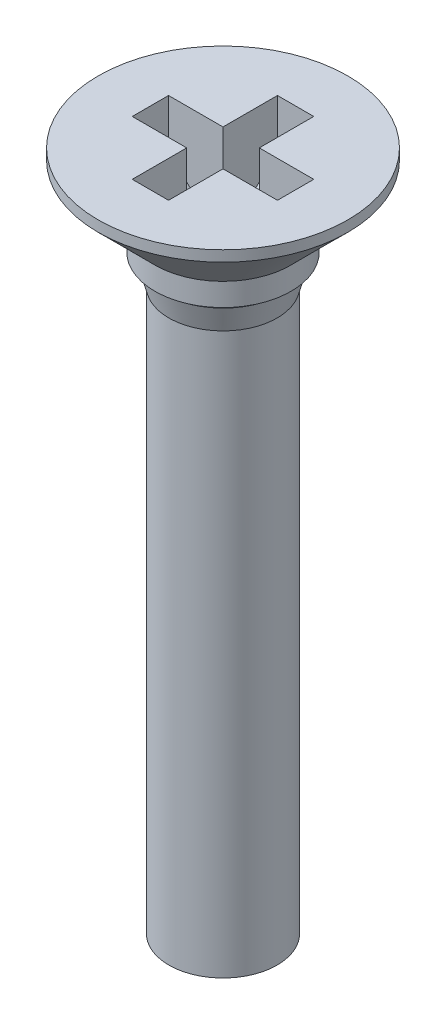
ISO-10303-21;
HEADER;
FILE_DESCRIPTION(('STEP AP214'),'2;1');
FILE_NAME('part.step','',(''),(''),'','','');
FILE_SCHEMA(('AUTOMOTIVE_DESIGN { 1 0 10303 214 1 1 1 1 }'));
ENDSEC;
DATA;
#1=APPLICATION_CONTEXT('core data for automotive mechanical design processes');
#2=APPLICATION_PROTOCOL_DEFINITION('international standard','automotive_design',2000,#1);
#3=PRODUCT_CONTEXT('',#1,'mechanical');
#4=PRODUCT('Part','Part','',(#3));
#5=PRODUCT_RELATED_PRODUCT_CATEGORY('part','',(#4));
#6=PRODUCT_DEFINITION_FORMATION('','',#4);
#7=PRODUCT_DEFINITION_CONTEXT('part definition',#1,'design');
#8=PRODUCT_DEFINITION('design','',#6,#7);
#9=PRODUCT_DEFINITION_SHAPE('','',#8);
#10=(LENGTH_UNIT() NAMED_UNIT(*) SI_UNIT(.MILLI.,.METRE.));
#11=(NAMED_UNIT(*) PLANE_ANGLE_UNIT() SI_UNIT($,.RADIAN.));
#12=(NAMED_UNIT(*) SI_UNIT($,.STERADIAN.) SOLID_ANGLE_UNIT());
#13=UNCERTAINTY_MEASURE_WITH_UNIT(LENGTH_MEASURE(1.E-05),#10,'distance_accuracy_value','');
#14=(GEOMETRIC_REPRESENTATION_CONTEXT(3) GLOBAL_UNCERTAINTY_ASSIGNED_CONTEXT((#13)) GLOBAL_UNIT_ASSIGNED_CONTEXT((#10,
#11,#12)) REPRESENTATION_CONTEXT('',''));
#15=CARTESIAN_POINT('',(0.,0.,0.));
#16=DIRECTION('',(0.,0.,1.));
#17=DIRECTION('',(1.,0.,0.));
#18=AXIS2_PLACEMENT_3D('',#15,#16,#17);
#19=CARTESIAN_POINT('',(0.,-2.65,-0.4));
#20=DIRECTION('',(0.,0.,-1.));
#21=DIRECTION('',(-1.,0.,0.));
#22=AXIS2_PLACEMENT_3D('',#19,#20,#21);
#23=PLANE('',#22);
#24=DIRECTION('',(0.,1.,0.));
#25=VECTOR('',#24,1.);
#26=CARTESIAN_POINT('',(0.4,-2.65,-0.4));
#27=LINE('',#26,#25);
#28=CARTESIAN_POINT('',(0.4,-2.1,-0.4));
#29=VERTEX_POINT('',#28);
#30=CARTESIAN_POINT('',(0.4,0.,-0.4));
#31=VERTEX_POINT('',#30);
#32=EDGE_CURVE('E208',#29,#31,#27,.T.);
#33=ORIENTED_EDGE('',*,*,#32,.F.);
#34=DIRECTION('',(1.,0.,0.));
#35=VECTOR('',#34,1.);
#36=CARTESIAN_POINT('',(-0.550000000000002,-2.1,-0.4));
#37=LINE('',#36,#35);
#38=CARTESIAN_POINT('',(0.550000000000002,-2.1,-0.4));
#39=VERTEX_POINT('',#38);
#40=EDGE_CURVE('E243',#29,#39,#37,.T.);
#41=ORIENTED_EDGE('',*,*,#40,.T.);
#42=DIRECTION('',(0.707106781186546,0.707106781186548,0.));
#43=VECTOR('',#42,1.);
#44=CARTESIAN_POINT('',(1.6,-1.05,-0.4));
#45=LINE('',#44,#43);
#46=CARTESIAN_POINT('',(1.6,-1.05,-0.4));
#47=VERTEX_POINT('',#46);
#48=EDGE_CURVE('E247',#39,#47,#45,.T.);
#49=ORIENTED_EDGE('',*,*,#48,.T.);
#50=DIRECTION('',(0.,1.,0.));
#51=VECTOR('',#50,1.);
#52=CARTESIAN_POINT('',(1.6,0.,-0.4));
#53=LINE('',#52,#51);
#54=CARTESIAN_POINT('',(1.6,0.,-0.4));
#55=VERTEX_POINT('',#54);
#56=EDGE_CURVE('E250',#47,#55,#53,.T.);
#57=ORIENTED_EDGE('',*,*,#56,.T.);
#58=DIRECTION('',(-1.,0.,0.));
#59=VECTOR('',#58,1.);
#60=CARTESIAN_POINT('',(1.6,0.,-0.4));
#61=LINE('',#60,#59);
#62=EDGE_CURVE('E254',#55,#31,#61,.T.);
#63=ORIENTED_EDGE('',*,*,#62,.T.);
#64=EDGE_LOOP('',(#33,#41,#49,#57,#63));
#65=FACE_BOUND('',#64,.T.);
#66=ADVANCED_FACE('F43',(#65),#23,.F.);
#67=CARTESIAN_POINT('',(0.,-2.65,0.4));
#68=DIRECTION('',(0.,0.,-1.));
#69=DIRECTION('',(-1.,0.,0.));
#70=AXIS2_PLACEMENT_3D('',#67,#68,#69);
#71=PLANE('',#70);
#72=DIRECTION('',(1.,0.,0.));
#73=VECTOR('',#72,1.);
#74=CARTESIAN_POINT('',(-0.550000000000002,-2.1,0.4));
#75=LINE('',#74,#73);
#76=CARTESIAN_POINT('',(0.4,-2.1,0.4));
#77=VERTEX_POINT('',#76);
#78=CARTESIAN_POINT('',(0.550000000000002,-2.1,0.4));
#79=VERTEX_POINT('',#78);
#80=EDGE_CURVE('E225',#77,#79,#75,.T.);
#81=ORIENTED_EDGE('',*,*,#80,.F.);
#82=DIRECTION('',(0.,1.,0.));
#83=VECTOR('',#82,1.);
#84=CARTESIAN_POINT('',(0.4,-2.65,0.4));
#85=LINE('',#84,#83);
#86=CARTESIAN_POINT('',(0.4,0.,0.4));
#87=VERTEX_POINT('',#86);
#88=EDGE_CURVE('E51',#77,#87,#85,.T.);
#89=ORIENTED_EDGE('',*,*,#88,.T.);
#90=DIRECTION('',(-1.,0.,0.));
#91=VECTOR('',#90,1.);
#92=CARTESIAN_POINT('',(1.6,0.,0.4));
#93=LINE('',#92,#91);
#94=CARTESIAN_POINT('',(1.6,0.,0.4));
#95=VERTEX_POINT('',#94);
#96=EDGE_CURVE('E234',#95,#87,#93,.T.);
#97=ORIENTED_EDGE('',*,*,#96,.F.);
#98=DIRECTION('',(0.,1.,0.));
#99=VECTOR('',#98,1.);
#100=CARTESIAN_POINT('',(1.6,0.,0.4));
#101=LINE('',#100,#99);
#102=CARTESIAN_POINT('',(1.6,-1.05,0.4));
#103=VERTEX_POINT('',#102);
#104=EDGE_CURVE('E231',#103,#95,#101,.T.);
#105=ORIENTED_EDGE('',*,*,#104,.F.);
#106=DIRECTION('',(0.707106781186546,0.707106781186548,0.));
#107=VECTOR('',#106,1.);
#108=CARTESIAN_POINT('',(1.6,-1.05,0.4));
#109=LINE('',#108,#107);
#110=EDGE_CURVE('E228',#79,#103,#109,.T.);
#111=ORIENTED_EDGE('',*,*,#110,.F.);
#112=EDGE_LOOP('',(#81,#89,#97,#105,#111));
#113=FACE_BOUND('',#112,.T.);
#114=ADVANCED_FACE('F297',(#113),#71,.T.);
#115=CARTESIAN_POINT('',(0.,0.,0.));
#116=DIRECTION('',(0.,-1.,0.));
#117=DIRECTION('',(1.,0.,0.));
#118=AXIS2_PLACEMENT_3D('',#115,#116,#117);
#119=PLANE('',#118);
#120=DIRECTION('',(1.,0.,0.));
#121=VECTOR('',#120,1.);
#122=CARTESIAN_POINT('',(-0.4,0.,1.6));
#123=LINE('',#122,#121);
#124=CARTESIAN_POINT('',(-0.4,0.,1.6));
#125=VERTEX_POINT('',#124);
#126=CARTESIAN_POINT('',(0.4,0.,1.6));
#127=VERTEX_POINT('',#126);
#128=EDGE_CURVE('E209',#125,#127,#123,.T.);
#129=ORIENTED_EDGE('',*,*,#128,.F.);
#130=DIRECTION('',(0.,0.,1.));
#131=VECTOR('',#130,1.);
#132=CARTESIAN_POINT('',(-0.4,0.,-1.6));
#133=LINE('',#132,#131);
#134=CARTESIAN_POINT('',(-0.4,0.,0.399999999999999));
#135=VERTEX_POINT('',#134);
#136=EDGE_CURVE('E202',#135,#125,#133,.T.);
#137=ORIENTED_EDGE('',*,*,#136,.F.);
#138=CARTESIAN_POINT('',(-1.6,0.,0.4));
#139=VERTEX_POINT('',#138);
#140=EDGE_CURVE('E233',#135,#139,#93,.T.);
#141=ORIENTED_EDGE('',*,*,#140,.T.);
#142=DIRECTION('',(0.,0.,1.));
#143=VECTOR('',#142,1.);
#144=CARTESIAN_POINT('',(-1.6,0.,-0.4));
#145=LINE('',#144,#143);
#146=CARTESIAN_POINT('',(-1.6,0.,-0.4));
#147=VERTEX_POINT('',#146);
#148=EDGE_CURVE('E264',#147,#139,#145,.T.);
#149=ORIENTED_EDGE('',*,*,#148,.F.);
#150=CARTESIAN_POINT('',(-0.4,0.,-0.4));
#151=VERTEX_POINT('',#150);
#152=EDGE_CURVE('E253',#151,#147,#61,.T.);
#153=ORIENTED_EDGE('',*,*,#152,.F.);
#154=CARTESIAN_POINT('',(-0.4,0.,-1.6));
#155=VERTEX_POINT('',#154);
#156=EDGE_CURVE('E203',#155,#151,#133,.T.);
#157=ORIENTED_EDGE('',*,*,#156,.F.);
#158=DIRECTION('',(1.,0.,0.));
#159=VECTOR('',#158,1.);
#160=CARTESIAN_POINT('',(-0.4,0.,-1.6));
#161=LINE('',#160,#159);
#162=CARTESIAN_POINT('',(0.4,0.,-1.6));
#163=VERTEX_POINT('',#162);
#164=EDGE_CURVE('E211',#155,#163,#161,.T.);
#165=ORIENTED_EDGE('',*,*,#164,.T.);
#166=DIRECTION('',(0.,0.,1.));
#167=VECTOR('',#166,1.);
#168=CARTESIAN_POINT('',(0.4,0.,-1.6));
#169=LINE('',#168,#167);
#170=EDGE_CURVE('E187',#163,#31,#169,.T.);
#171=ORIENTED_EDGE('',*,*,#170,.T.);
#172=ORIENTED_EDGE('',*,*,#62,.F.);
#173=DIRECTION('',(0.,0.,1.));
#174=VECTOR('',#173,1.);
#175=CARTESIAN_POINT('',(1.6,0.,-0.4));
#176=LINE('',#175,#174);
#177=EDGE_CURVE('E267',#55,#95,#176,.T.);
#178=ORIENTED_EDGE('',*,*,#177,.T.);
#179=ORIENTED_EDGE('',*,*,#96,.T.);
#180=EDGE_CURVE('E66',#87,#127,#169,.T.);
#181=ORIENTED_EDGE('',*,*,#180,.T.);
#182=EDGE_LOOP('',(#129,#137,#141,#149,#153,#157,#165,#171,#172,#178,#179,#181));
#183=FACE_BOUND('',#182,.T.);
#184=CARTESIAN_POINT('',(0.,0.,0.));
#185=DIRECTION('',(0.,1.,0.));
#186=DIRECTION('',(-1.,0.,0.));
#187=AXIS2_PLACEMENT_3D('',#184,#185,#186);
#188=CIRCLE('',#187,2.75);
#189=CARTESIAN_POINT('',(-2.75,0.,0.));
#190=VERTEX_POINT('',#189);
#191=EDGE_CURVE('E293',#190,#190,#188,.T.);
#192=ORIENTED_EDGE('',*,*,#191,.T.);
#193=EDGE_LOOP('',(#192));
#194=FACE_BOUND('',#193,.T.);
#195=ADVANCED_FACE('F45',(#183,#194),#119,.F.);
#196=CARTESIAN_POINT('',(0.,0.,0.));
#197=DIRECTION('',(0.,1.,0.));
#198=DIRECTION('',(-1.,0.,0.));
#199=AXIS2_PLACEMENT_3D('',#196,#197,#198);
#200=CYLINDRICAL_SURFACE('',#199,2.75);
#201=ORIENTED_EDGE('',*,*,#191,.F.);
#202=EDGE_LOOP('',(#201));
#203=FACE_BOUND('',#202,.T.);
#204=CARTESIAN_POINT('',(0.,-0.237500000000007,0.));
#205=DIRECTION('',(0.,1.,0.));
#206=DIRECTION('',(-1.,0.,0.));
#207=AXIS2_PLACEMENT_3D('',#204,#205,#206);
#208=CIRCLE('',#207,2.75);
#209=CARTESIAN_POINT('',(-2.75,-0.237500000000007,0.));
#210=VERTEX_POINT('',#209);
#211=EDGE_CURVE('E290',#210,#210,#208,.T.);
#212=ORIENTED_EDGE('',*,*,#211,.T.);
#213=EDGE_LOOP('',(#212));
#214=FACE_BOUND('',#213,.T.);
#215=ADVANCED_FACE('F402',(#203,#214),#200,.T.);
#216=CARTESIAN_POINT('',(0.,-1.4875,0.));
#217=DIRECTION('',(0.,1.,0.));
#218=DIRECTION('',(-1.,0.,0.));
#219=AXIS2_PLACEMENT_3D('',#216,#217,#218);
#220=CONICAL_SURFACE('',#219,1.5,0.78539816339745);
#221=ORIENTED_EDGE('',*,*,#211,.F.);
#222=EDGE_LOOP('',(#221));
#223=FACE_BOUND('',#222,.T.);
#224=CARTESIAN_POINT('',(0.,-1.4875,0.));
#225=DIRECTION('',(0.,1.,0.));
#226=DIRECTION('',(-1.,0.,0.));
#227=AXIS2_PLACEMENT_3D('',#224,#225,#226);
#228=CIRCLE('',#227,1.5);
#229=CARTESIAN_POINT('',(-1.5,-1.4875,0.));
#230=VERTEX_POINT('',#229);
#231=EDGE_CURVE('E287',#230,#230,#228,.T.);
#232=ORIENTED_EDGE('',*,*,#231,.T.);
#233=EDGE_LOOP('',(#232));
#234=FACE_BOUND('',#233,.T.);
#235=ADVANCED_FACE('F399',(#223,#234),#220,.T.);
#236=CARTESIAN_POINT('',(0.,0.,0.));
#237=DIRECTION('',(0.,1.,0.));
#238=DIRECTION('',(-1.,0.,0.));
#239=AXIS2_PLACEMENT_3D('',#236,#237,#238);
#240=CYLINDRICAL_SURFACE('',#239,1.5);
#241=ORIENTED_EDGE('',*,*,#231,.F.);
#242=EDGE_LOOP('',(#241));
#243=FACE_BOUND('',#242,.T.);
#244=CARTESIAN_POINT('',(0.,-1.9875,0.));
#245=DIRECTION('',(0.,1.,0.));
#246=DIRECTION('',(-1.,0.,0.));
#247=AXIS2_PLACEMENT_3D('',#244,#245,#246);
#248=CIRCLE('',#247,1.5);
#249=CARTESIAN_POINT('',(-1.5,-1.9875,0.));
#250=VERTEX_POINT('',#249);
#251=EDGE_CURVE('E284',#250,#250,#248,.T.);
#252=ORIENTED_EDGE('',*,*,#251,.T.);
#253=EDGE_LOOP('',(#252));
#254=FACE_BOUND('',#253,.T.);
#255=ADVANCED_FACE('F395',(#243,#254),#240,.T.);
#256=CARTESIAN_POINT('',(1.5,-1.9875,0.));
#257=DIRECTION('',(0.,1.,0.));
#258=DIRECTION('',(-1.,0.,0.));
#259=AXIS2_PLACEMENT_3D('',#256,#257,#258);
#260=PLANE('',#259);
#261=ORIENTED_EDGE('',*,*,#251,.F.);
#262=EDGE_LOOP('',(#261));
#263=FACE_BOUND('',#262,.T.);
#264=CARTESIAN_POINT('',(0.,-1.9875,0.));
#265=DIRECTION('',(0.,1.,0.));
#266=DIRECTION('',(-1.,0.,0.));
#267=AXIS2_PLACEMENT_3D('',#264,#265,#266);
#268=CIRCLE('',#267,1.3375);
#269=CARTESIAN_POINT('',(-1.3375,-1.9875,0.));
#270=VERTEX_POINT('',#269);
#271=EDGE_CURVE('E281',#270,#270,#268,.T.);
#272=ORIENTED_EDGE('',*,*,#271,.T.);
#273=EDGE_LOOP('',(#272));
#274=FACE_BOUND('',#273,.T.);
#275=ADVANCED_FACE('F391',(#263,#274),#260,.F.);
#276=CARTESIAN_POINT('',(0.,0.,0.));
#277=DIRECTION('',(0.,1.,0.));
#278=DIRECTION('',(-1.,0.,0.));
#279=AXIS2_PLACEMENT_3D('',#276,#277,#278);
#280=CYLINDRICAL_SURFACE('',#279,1.3375);
#281=ORIENTED_EDGE('',*,*,#271,.F.);
#282=EDGE_LOOP('',(#281));
#283=FACE_BOUND('',#282,.T.);
#284=CARTESIAN_POINT('',(0.,-2.11258468371008,0.));
#285=DIRECTION('',(0.,1.,0.));
#286=DIRECTION('',(-1.,0.,0.));
#287=AXIS2_PLACEMENT_3D('',#284,#285,#286);
#288=CIRCLE('',#287,1.3375);
#289=CARTESIAN_POINT('',(-1.3375,-2.11258468371008,0.));
#290=VERTEX_POINT('',#289);
#291=EDGE_CURVE('E278',#290,#290,#288,.T.);
#292=ORIENTED_EDGE('',*,*,#291,.T.);
#293=EDGE_LOOP('',(#292));
#294=FACE_BOUND('',#293,.T.);
#295=ADVANCED_FACE('F387',(#283,#294),#280,.T.);
#296=CARTESIAN_POINT('',(0.,-2.65,0.));
#297=DIRECTION('',(0.,1.,0.));
#298=DIRECTION('',(-1.,0.,0.));
#299=AXIS2_PLACEMENT_3D('',#296,#297,#298);
#300=CONICAL_SURFACE('',#299,1.1935,0.26179938779915);
#301=ORIENTED_EDGE('',*,*,#291,.F.);
#302=EDGE_LOOP('',(#301));
#303=FACE_BOUND('',#302,.T.);
#304=CARTESIAN_POINT('',(0.,-2.65,0.));
#305=DIRECTION('',(0.,1.,0.));
#306=DIRECTION('',(-1.,0.,0.));
#307=AXIS2_PLACEMENT_3D('',#304,#305,#306);
#308=CIRCLE('',#307,1.1935);
#309=CARTESIAN_POINT('',(-1.1935,-2.65,0.));
#310=VERTEX_POINT('',#309);
#311=EDGE_CURVE('E263',#310,#310,#308,.T.);
#312=ORIENTED_EDGE('',*,*,#311,.T.);
#313=EDGE_LOOP('',(#312));
#314=FACE_BOUND('',#313,.T.);
#315=ADVANCED_FACE('F383',(#303,#314),#300,.T.);
#316=CARTESIAN_POINT('',(0.,0.,0.));
#317=DIRECTION('',(0.,1.,0.));
#318=DIRECTION('',(-1.,0.,0.));
#319=AXIS2_PLACEMENT_3D('',#316,#317,#318);
#320=CYLINDRICAL_SURFACE('',#319,1.1935);
#321=ORIENTED_EDGE('',*,*,#311,.F.);
#322=EDGE_LOOP('',(#321));
#323=FACE_BOUND('',#322,.T.);
#324=CARTESIAN_POINT('',(0.,-15.,0.));
#325=DIRECTION('',(0.,-1.,0.));
#326=DIRECTION('',(1.,0.,0.));
#327=AXIS2_PLACEMENT_3D('',#324,#325,#326);
#328=CIRCLE('',#327,1.1935);
#329=CARTESIAN_POINT('',(1.1935,-15.,0.));
#330=VERTEX_POINT('',#329);
#331=EDGE_CURVE('E178',#330,#330,#328,.T.);
#332=ORIENTED_EDGE('',*,*,#331,.F.);
#333=EDGE_LOOP('',(#332));
#334=FACE_BOUND('',#333,.T.);
#335=ADVANCED_FACE('F380',(#323,#334),#320,.T.);
#336=CARTESIAN_POINT('',(-1.6,-1.05,-0.4));
#337=DIRECTION('',(-0.707106781186548,-0.707106781186546,0.));
#338=DIRECTION('',(0.707106781186547,-0.707106781186548,0.));
#339=AXIS2_PLACEMENT_3D('',#336,#337,#338);
#340=PLANE('',#339);
#341=DIRECTION('',(0.,0.,1.));
#342=VECTOR('',#341,1.);
#343=CARTESIAN_POINT('',(-0.550000000000002,-2.1,-0.4));
#344=LINE('',#343,#342);
#345=CARTESIAN_POINT('',(-0.550000000000002,-2.1,-0.4));
#346=VERTEX_POINT('',#345);
#347=CARTESIAN_POINT('',(-0.550000000000002,-2.1,0.4));
#348=VERTEX_POINT('',#347);
#349=EDGE_CURVE('E260',#346,#348,#344,.T.);
#350=ORIENTED_EDGE('',*,*,#349,.F.);
#351=DIRECTION('',(0.707106781186546,-0.707106781186548,0.));
#352=VECTOR('',#351,1.);
#353=CARTESIAN_POINT('',(-1.6,-1.05,-0.4));
#354=LINE('',#353,#352);
#355=CARTESIAN_POINT('',(-1.6,-1.05,-0.4));
#356=VERTEX_POINT('',#355);
#357=EDGE_CURVE('E240',#356,#346,#354,.T.);
#358=ORIENTED_EDGE('',*,*,#357,.F.);
#359=DIRECTION('',(0.,0.,1.));
#360=VECTOR('',#359,1.);
#361=CARTESIAN_POINT('',(-1.6,-1.05,-0.4));
#362=LINE('',#361,#360);
#363=CARTESIAN_POINT('',(-1.6,-1.05,0.4));
#364=VERTEX_POINT('',#363);
#365=EDGE_CURVE('E261',#356,#364,#362,.T.);
#366=ORIENTED_EDGE('',*,*,#365,.T.);
#367=DIRECTION('',(0.707106781186546,-0.707106781186548,0.));
#368=VECTOR('',#367,1.);
#369=CARTESIAN_POINT('',(-1.6,-1.05,0.4));
#370=LINE('',#369,#368);
#371=EDGE_CURVE('E222',#364,#348,#370,.T.);
#372=ORIENTED_EDGE('',*,*,#371,.T.);
#373=EDGE_LOOP('',(#350,#358,#366,#372));
#374=FACE_BOUND('',#373,.T.);
#375=ADVANCED_FACE('F334',(#374),#340,.F.);
#376=CARTESIAN_POINT('',(-1.6,0.,-0.4));
#377=DIRECTION('',(-1.,0.,0.));
#378=DIRECTION('',(0.,0.,1.));
#379=AXIS2_PLACEMENT_3D('',#376,#377,#378);
#380=PLANE('',#379);
#381=ORIENTED_EDGE('',*,*,#365,.F.);
#382=DIRECTION('',(0.,-1.,0.));
#383=VECTOR('',#382,1.);
#384=CARTESIAN_POINT('',(-1.6,0.,-0.4));
#385=LINE('',#384,#383);
#386=EDGE_CURVE('E257',#147,#356,#385,.T.);
#387=ORIENTED_EDGE('',*,*,#386,.F.);
#388=ORIENTED_EDGE('',*,*,#148,.T.);
#389=DIRECTION('',(0.,-1.,0.));
#390=VECTOR('',#389,1.);
#391=CARTESIAN_POINT('',(-1.6,0.,0.4));
#392=LINE('',#391,#390);
#393=EDGE_CURVE('E237',#139,#364,#392,.T.);
#394=ORIENTED_EDGE('',*,*,#393,.T.);
#395=EDGE_LOOP('',(#381,#387,#388,#394));
#396=FACE_BOUND('',#395,.T.);
#397=ADVANCED_FACE('F379',(#396),#380,.F.);
#398=CARTESIAN_POINT('',(1.6,0.,-0.4));
#399=DIRECTION('',(1.,0.,0.));
#400=DIRECTION('',(0.,0.,-1.));
#401=AXIS2_PLACEMENT_3D('',#398,#399,#400);
#402=PLANE('',#401);
#403=ORIENTED_EDGE('',*,*,#177,.F.);
#404=ORIENTED_EDGE('',*,*,#56,.F.);
#405=DIRECTION('',(0.,0.,1.));
#406=VECTOR('',#405,1.);
#407=CARTESIAN_POINT('',(1.6,-1.05,-0.4));
#408=LINE('',#407,#406);
#409=EDGE_CURVE('E270',#47,#103,#408,.T.);
#410=ORIENTED_EDGE('',*,*,#409,.T.);
#411=ORIENTED_EDGE('',*,*,#104,.T.);
#412=EDGE_LOOP('',(#403,#404,#410,#411));
#413=FACE_BOUND('',#412,.T.);
#414=ADVANCED_FACE('F306',(#413),#402,.F.);
#415=CARTESIAN_POINT('',(1.6,-1.05,-0.4));
#416=DIRECTION('',(0.707106781186548,-0.707106781186546,0.));
#417=DIRECTION('',(0.707106781186547,0.707106781186548,0.));
#418=AXIS2_PLACEMENT_3D('',#415,#416,#417);
#419=PLANE('',#418);
#420=ORIENTED_EDGE('',*,*,#409,.F.);
#421=ORIENTED_EDGE('',*,*,#48,.F.);
#422=DIRECTION('',(0.,0.,1.));
#423=VECTOR('',#422,1.);
#424=CARTESIAN_POINT('',(0.550000000000002,-2.1,-0.4));
#425=LINE('',#424,#423);
#426=EDGE_CURVE('E272',#39,#79,#425,.T.);
#427=ORIENTED_EDGE('',*,*,#426,.T.);
#428=ORIENTED_EDGE('',*,*,#110,.T.);
#429=EDGE_LOOP('',(#420,#421,#427,#428));
#430=FACE_BOUND('',#429,.T.);
#431=ADVANCED_FACE('F312',(#430),#419,.F.);
#432=CARTESIAN_POINT('',(-0.550000000000002,-2.1,-0.4));
#433=DIRECTION('',(0.,-1.,0.));
#434=DIRECTION('',(0.,0.,-1.));
#435=AXIS2_PLACEMENT_3D('',#432,#433,#434);
#436=PLANE('',#435);
#437=CARTESIAN_POINT('',(-0.4,-2.1,0.4));
#438=VERTEX_POINT('',#437);
#439=EDGE_CURVE('E226',#348,#438,#75,.T.);
#440=ORIENTED_EDGE('',*,*,#439,.T.);
#441=DIRECTION('',(0.,0.,-1.));
#442=VECTOR('',#441,1.);
#443=CARTESIAN_POINT('',(-0.4,-2.1,0.550000000000002));
#444=LINE('',#443,#442);
#445=CARTESIAN_POINT('',(-0.4,-2.1,0.550000000000002));
#446=VERTEX_POINT('',#445);
#447=EDGE_CURVE('E162',#446,#438,#444,.T.);
#448=ORIENTED_EDGE('',*,*,#447,.F.);
#449=DIRECTION('',(1.,0.,0.));
#450=VECTOR('',#449,1.);
#451=CARTESIAN_POINT('',(-0.4,-2.1,0.550000000000002));
#452=LINE('',#451,#450);
#453=CARTESIAN_POINT('',(0.4,-2.1,0.550000000000002));
#454=VERTEX_POINT('',#453);
#455=EDGE_CURVE('E156',#446,#454,#452,.T.);
#456=ORIENTED_EDGE('',*,*,#455,.T.);
#457=DIRECTION('',(0.,0.,-1.));
#458=VECTOR('',#457,1.);
#459=CARTESIAN_POINT('',(0.4,-2.1,0.550000000000002));
#460=LINE('',#459,#458);
#461=EDGE_CURVE('E160',#454,#77,#460,.T.);
#462=ORIENTED_EDGE('',*,*,#461,.T.);
#463=ORIENTED_EDGE('',*,*,#80,.T.);
#464=ORIENTED_EDGE('',*,*,#426,.F.);
#465=ORIENTED_EDGE('',*,*,#40,.F.);
#466=CARTESIAN_POINT('',(0.4,-2.1,-0.550000000000002));
#467=VERTEX_POINT('',#466);
#468=EDGE_CURVE('E58',#29,#467,#460,.T.);
#469=ORIENTED_EDGE('',*,*,#468,.T.);
#470=DIRECTION('',(1.,0.,0.));
#471=VECTOR('',#470,1.);
#472=CARTESIAN_POINT('',(-0.4,-2.1,-0.550000000000002));
#473=LINE('',#472,#471);
#474=CARTESIAN_POINT('',(-0.4,-2.1,-0.550000000000002));
#475=VERTEX_POINT('',#474);
#476=EDGE_CURVE('E167',#475,#467,#473,.T.);
#477=ORIENTED_EDGE('',*,*,#476,.F.);
#478=CARTESIAN_POINT('',(-0.4,-2.1,-0.4));
#479=VERTEX_POINT('',#478);
#480=EDGE_CURVE('E194',#479,#475,#444,.T.);
#481=ORIENTED_EDGE('',*,*,#480,.F.);
#482=EDGE_CURVE('E244',#346,#479,#37,.T.);
#483=ORIENTED_EDGE('',*,*,#482,.F.);
#484=ORIENTED_EDGE('',*,*,#349,.T.);
#485=EDGE_LOOP('',(#440,#448,#456,#462,#463,#464,#465,#469,#477,#481,#483,#484));
#486=FACE_BOUND('',#485,.T.);
#487=ADVANCED_FACE('F159',(#486),#436,.F.);
#488=ORIENTED_EDGE('',*,*,#482,.T.);
#489=DIRECTION('',(0.,1.,0.));
#490=VECTOR('',#489,1.);
#491=CARTESIAN_POINT('',(-0.4,-2.65,-0.4));
#492=LINE('',#491,#490);
#493=EDGE_CURVE('E219',#479,#151,#492,.T.);
#494=ORIENTED_EDGE('',*,*,#493,.T.);
#495=ORIENTED_EDGE('',*,*,#152,.T.);
#496=ORIENTED_EDGE('',*,*,#386,.T.);
#497=ORIENTED_EDGE('',*,*,#357,.T.);
#498=EDGE_LOOP('',(#488,#494,#495,#496,#497));
#499=FACE_BOUND('',#498,.T.);
#500=ADVANCED_FACE('F329',(#499),#23,.F.);
#501=DIRECTION('',(0.,1.,0.));
#502=VECTOR('',#501,1.);
#503=CARTESIAN_POINT('',(-0.4,-2.65,0.4));
#504=LINE('',#503,#502);
#505=EDGE_CURVE('E11',#438,#135,#504,.T.);
#506=ORIENTED_EDGE('',*,*,#505,.F.);
#507=ORIENTED_EDGE('',*,*,#439,.F.);
#508=ORIENTED_EDGE('',*,*,#371,.F.);
#509=ORIENTED_EDGE('',*,*,#393,.F.);
#510=ORIENTED_EDGE('',*,*,#140,.F.);
#511=EDGE_LOOP('',(#506,#507,#508,#509,#510));
#512=FACE_BOUND('',#511,.T.);
#513=ADVANCED_FACE('F339',(#512),#71,.T.);
#514=CARTESIAN_POINT('',(-0.4,-1.05,1.6));
#515=DIRECTION('',(0.,-0.707106781186546,0.707106781186548));
#516=DIRECTION('',(0.,-0.707106781186548,-0.707106781186547));
#517=AXIS2_PLACEMENT_3D('',#514,#515,#516);
#518=PLANE('',#517);
#519=ORIENTED_EDGE('',*,*,#455,.F.);
#520=DIRECTION('',(0.,-0.707106781186548,-0.707106781186546));
#521=VECTOR('',#520,1.);
#522=CARTESIAN_POINT('',(-0.4,-1.05,1.6));
#523=LINE('',#522,#521);
#524=CARTESIAN_POINT('',(-0.4,-1.05,1.6));
#525=VERTEX_POINT('',#524);
#526=EDGE_CURVE('E192',#525,#446,#523,.T.);
#527=ORIENTED_EDGE('',*,*,#526,.F.);
#528=DIRECTION('',(1.,0.,0.));
#529=VECTOR('',#528,1.);
#530=CARTESIAN_POINT('',(-0.4,-1.05,1.6));
#531=LINE('',#530,#529);
#532=CARTESIAN_POINT('',(0.4,-1.05,1.6));
#533=VERTEX_POINT('',#532);
#534=EDGE_CURVE('E176',#525,#533,#531,.T.);
#535=ORIENTED_EDGE('',*,*,#534,.T.);
#536=DIRECTION('',(0.,-0.707106781186548,-0.707106781186546));
#537=VECTOR('',#536,1.);
#538=CARTESIAN_POINT('',(0.4,-1.05,1.6));
#539=LINE('',#538,#537);
#540=EDGE_CURVE('E172',#533,#454,#539,.T.);
#541=ORIENTED_EDGE('',*,*,#540,.T.);
#542=EDGE_LOOP('',(#519,#527,#535,#541));
#543=FACE_BOUND('',#542,.T.);
#544=ADVANCED_FACE('F175',(#543),#518,.F.);
#545=CARTESIAN_POINT('',(-0.4,-2.65,0.));
#546=DIRECTION('',(-1.,0.,0.));
#547=DIRECTION('',(0.,0.,1.));
#548=AXIS2_PLACEMENT_3D('',#545,#546,#547);
#549=PLANE('',#548);
#550=ORIENTED_EDGE('',*,*,#505,.T.);
#551=ORIENTED_EDGE('',*,*,#136,.T.);
#552=DIRECTION('',(0.,-1.,0.));
#553=VECTOR('',#552,1.);
#554=CARTESIAN_POINT('',(-0.4,0.,1.6));
#555=LINE('',#554,#553);
#556=EDGE_CURVE('E168',#125,#525,#555,.T.);
#557=ORIENTED_EDGE('',*,*,#556,.T.);
#558=ORIENTED_EDGE('',*,*,#526,.T.);
#559=ORIENTED_EDGE('',*,*,#447,.T.);
#560=EDGE_LOOP('',(#550,#551,#557,#558,#559));
#561=FACE_BOUND('',#560,.T.);
#562=ADVANCED_FACE('F344',(#561),#549,.F.);
#563=CARTESIAN_POINT('',(0.4,-2.65,0.));
#564=DIRECTION('',(-1.,0.,0.));
#565=DIRECTION('',(0.,0.,1.));
#566=AXIS2_PLACEMENT_3D('',#563,#564,#565);
#567=PLANE('',#566);
#568=ORIENTED_EDGE('',*,*,#461,.F.);
#569=ORIENTED_EDGE('',*,*,#540,.F.);
#570=DIRECTION('',(0.,-1.,0.));
#571=VECTOR('',#570,1.);
#572=CARTESIAN_POINT('',(0.4,0.,1.6));
#573=LINE('',#572,#571);
#574=EDGE_CURVE('E190',#127,#533,#573,.T.);
#575=ORIENTED_EDGE('',*,*,#574,.F.);
#576=ORIENTED_EDGE('',*,*,#180,.F.);
#577=ORIENTED_EDGE('',*,*,#88,.F.);
#578=EDGE_LOOP('',(#568,#569,#575,#576,#577));
#579=FACE_BOUND('',#578,.T.);
#580=ADVANCED_FACE('F171',(#579),#567,.T.);
#581=CARTESIAN_POINT('',(-0.4,0.,1.6));
#582=DIRECTION('',(0.,0.,1.));
#583=DIRECTION('',(1.,0.,0.));
#584=AXIS2_PLACEMENT_3D('',#581,#582,#583);
#585=PLANE('',#584);
#586=ORIENTED_EDGE('',*,*,#534,.F.);
#587=ORIENTED_EDGE('',*,*,#556,.F.);
#588=ORIENTED_EDGE('',*,*,#128,.T.);
#589=ORIENTED_EDGE('',*,*,#574,.T.);
#590=EDGE_LOOP('',(#586,#587,#588,#589));
#591=FACE_BOUND('',#590,.T.);
#592=ADVANCED_FACE('F348',(#591),#585,.F.);
#593=ORIENTED_EDGE('',*,*,#480,.T.);
#594=DIRECTION('',(0.,0.707106781186548,-0.707106781186546));
#595=VECTOR('',#594,1.);
#596=CARTESIAN_POINT('',(-0.4,-1.05,-1.6));
#597=LINE('',#596,#595);
#598=CARTESIAN_POINT('',(-0.4,-1.05,-1.6));
#599=VERTEX_POINT('',#598);
#600=EDGE_CURVE('E196',#475,#599,#597,.T.);
#601=ORIENTED_EDGE('',*,*,#600,.T.);
#602=DIRECTION('',(0.,1.,0.));
#603=VECTOR('',#602,1.);
#604=CARTESIAN_POINT('',(-0.4,0.,-1.6));
#605=LINE('',#604,#603);
#606=EDGE_CURVE('E199',#599,#155,#605,.T.);
#607=ORIENTED_EDGE('',*,*,#606,.T.);
#608=ORIENTED_EDGE('',*,*,#156,.T.);
#609=ORIENTED_EDGE('',*,*,#493,.F.);
#610=EDGE_LOOP('',(#593,#601,#607,#608,#609));
#611=FACE_BOUND('',#610,.T.);
#612=ADVANCED_FACE('F326',(#611),#549,.F.);
#613=ORIENTED_EDGE('',*,*,#32,.T.);
#614=ORIENTED_EDGE('',*,*,#170,.F.);
#615=DIRECTION('',(0.,1.,0.));
#616=VECTOR('',#615,1.);
#617=CARTESIAN_POINT('',(0.4,0.,-1.6));
#618=LINE('',#617,#616);
#619=CARTESIAN_POINT('',(0.4,-1.05,-1.6));
#620=VERTEX_POINT('',#619);
#621=EDGE_CURVE('E185',#620,#163,#618,.T.);
#622=ORIENTED_EDGE('',*,*,#621,.F.);
#623=DIRECTION('',(0.,0.707106781186548,-0.707106781186546));
#624=VECTOR('',#623,1.);
#625=CARTESIAN_POINT('',(0.4,-1.05,-1.6));
#626=LINE('',#625,#624);
#627=EDGE_CURVE('E173',#467,#620,#626,.T.);
#628=ORIENTED_EDGE('',*,*,#627,.F.);
#629=ORIENTED_EDGE('',*,*,#468,.F.);
#630=EDGE_LOOP('',(#613,#614,#622,#628,#629));
#631=FACE_BOUND('',#630,.T.);
#632=ADVANCED_FACE('F319',(#631),#567,.T.);
#633=CARTESIAN_POINT('',(-0.4,0.,-1.6));
#634=DIRECTION('',(0.,0.,-1.));
#635=DIRECTION('',(-1.,0.,0.));
#636=AXIS2_PLACEMENT_3D('',#633,#634,#635);
#637=PLANE('',#636);
#638=ORIENTED_EDGE('',*,*,#164,.F.);
#639=ORIENTED_EDGE('',*,*,#606,.F.);
#640=DIRECTION('',(1.,0.,0.));
#641=VECTOR('',#640,1.);
#642=CARTESIAN_POINT('',(-0.4,-1.05,-1.6));
#643=LINE('',#642,#641);
#644=EDGE_CURVE('E214',#599,#620,#643,.T.);
#645=ORIENTED_EDGE('',*,*,#644,.T.);
#646=ORIENTED_EDGE('',*,*,#621,.T.);
#647=EDGE_LOOP('',(#638,#639,#645,#646));
#648=FACE_BOUND('',#647,.T.);
#649=ADVANCED_FACE('F322',(#648),#637,.F.);
#650=CARTESIAN_POINT('',(-0.4,-1.05,-1.6));
#651=DIRECTION('',(0.,-0.707106781186546,-0.707106781186548));
#652=DIRECTION('',(0.,0.707106781186548,-0.707106781186547));
#653=AXIS2_PLACEMENT_3D('',#650,#651,#652);
#654=PLANE('',#653);
#655=ORIENTED_EDGE('',*,*,#644,.F.);
#656=ORIENTED_EDGE('',*,*,#600,.F.);
#657=ORIENTED_EDGE('',*,*,#476,.T.);
#658=ORIENTED_EDGE('',*,*,#627,.T.);
#659=EDGE_LOOP('',(#655,#656,#657,#658));
#660=FACE_BOUND('',#659,.T.);
#661=ADVANCED_FACE('F317',(#660),#654,.F.);
#662=CARTESIAN_POINT('',(0.,-15.,0.));
#663=DIRECTION('',(0.,-1.,0.));
#664=DIRECTION('',(1.,0.,0.));
#665=AXIS2_PLACEMENT_3D('',#662,#663,#664);
#666=PLANE('',#665);
#667=ORIENTED_EDGE('',*,*,#331,.T.);
#668=EDGE_LOOP('',(#667));
#669=FACE_BOUND('',#668,.T.);
#670=ADVANCED_FACE('F425',(#669),#666,.T.);
#671=CLOSED_SHELL('',(#66,#114,#195,#215,#235,#255,#275,#295,#315,#335,#375,#397,#414,#431,#487,
#500,#513,#544,#562,#580,#592,#612,#632,#649,#661,#670));
#672=MANIFOLD_SOLID_BREP('B2',#671);
#673=ADVANCED_BREP_SHAPE_REPRESENTATION('',(#18,#672),#14);
#674=SHAPE_DEFINITION_REPRESENTATION(#9,#673);
ENDSEC;
END-ISO-10303-21;
